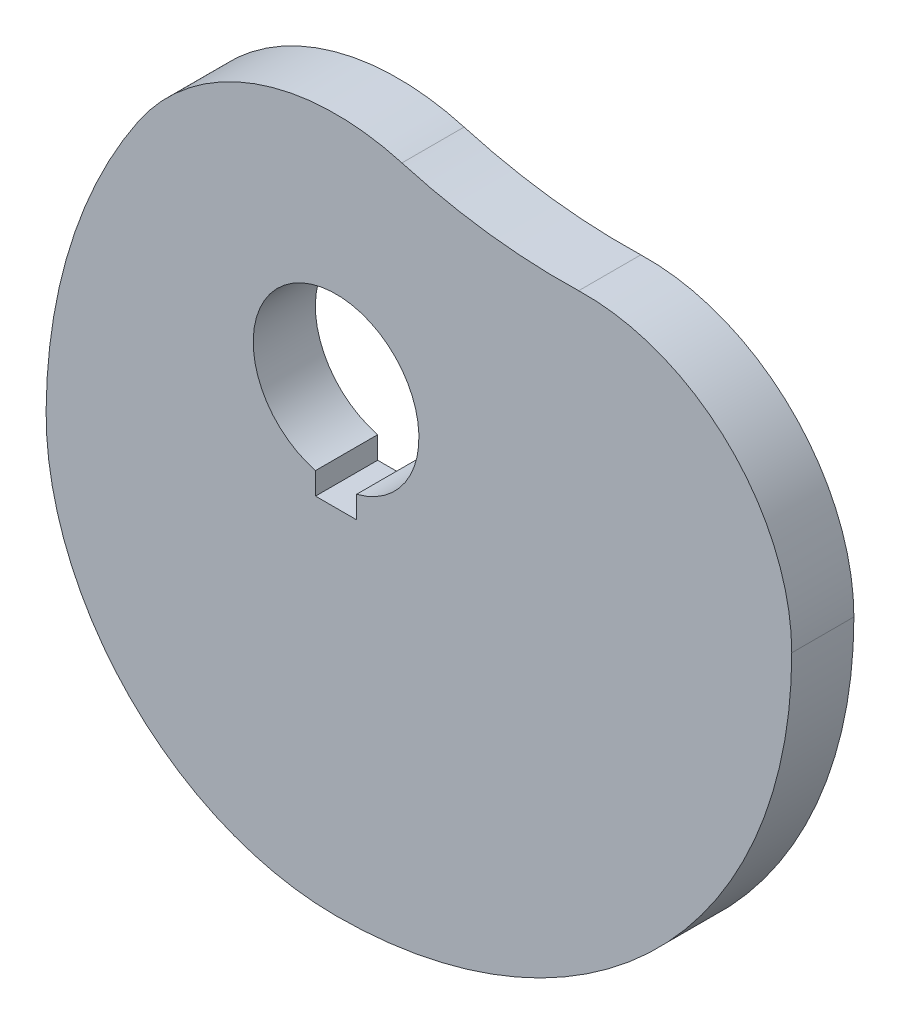
ISO-10303-21;
HEADER;
FILE_DESCRIPTION(('STEP AP214'),'2;1');
FILE_NAME('part.step','',(''),(''),'','','');
FILE_SCHEMA(('AUTOMOTIVE_DESIGN { 1 0 10303 214 1 1 1 1 }'));
ENDSEC;
DATA;
#1=APPLICATION_CONTEXT('core data for automotive mechanical design processes');
#2=APPLICATION_PROTOCOL_DEFINITION('international standard','automotive_design',2000,#1);
#3=PRODUCT_CONTEXT('',#1,'mechanical');
#4=PRODUCT('Part','Part','',(#3));
#5=PRODUCT_RELATED_PRODUCT_CATEGORY('part','',(#4));
#6=PRODUCT_DEFINITION_FORMATION('','',#4);
#7=PRODUCT_DEFINITION_CONTEXT('part definition',#1,'design');
#8=PRODUCT_DEFINITION('design','',#6,#7);
#9=PRODUCT_DEFINITION_SHAPE('','',#8);
#10=(LENGTH_UNIT() NAMED_UNIT(*) SI_UNIT(.MILLI.,.METRE.));
#11=(NAMED_UNIT(*) PLANE_ANGLE_UNIT() SI_UNIT($,.RADIAN.));
#12=(NAMED_UNIT(*) SI_UNIT($,.STERADIAN.) SOLID_ANGLE_UNIT());
#13=UNCERTAINTY_MEASURE_WITH_UNIT(LENGTH_MEASURE(1.E-05),#10,'distance_accuracy_value','');
#14=(GEOMETRIC_REPRESENTATION_CONTEXT(3) GLOBAL_UNCERTAINTY_ASSIGNED_CONTEXT((#13)) GLOBAL_UNIT_ASSIGNED_CONTEXT((#10,
#11,#12)) REPRESENTATION_CONTEXT('',''));
#15=CARTESIAN_POINT('',(0.,0.,0.));
#16=DIRECTION('',(0.,0.,1.));
#17=DIRECTION('',(1.,0.,0.));
#18=AXIS2_PLACEMENT_3D('',#15,#16,#17);
#19=CARTESIAN_POINT('',(1.57435915891416,-6.15173904182738,2.38125));
#20=DIRECTION('',(-1.,0.,0.));
#21=DIRECTION('',(0.,0.,1.));
#22=AXIS2_PLACEMENT_3D('',#19,#20,#21);
#23=PLANE('',#22);
#24=DIRECTION('',(0.,1.,0.));
#25=VECTOR('',#24,1.);
#26=CARTESIAN_POINT('',(1.57435915891416,-6.15173904182738,2.38125));
#27=LINE('',#26,#25);
#28=CARTESIAN_POINT('',(1.57435915891416,-7.84976349286583,2.38125));
#29=VERTEX_POINT('',#28);
#30=CARTESIAN_POINT('',(1.57435915891416,-6.15173904182737,2.38125));
#31=VERTEX_POINT('',#30);
#32=EDGE_CURVE('E102',#29,#31,#27,.T.);
#33=ORIENTED_EDGE('',*,*,#32,.T.);
#34=DIRECTION('',(0.,0.,-1.));
#35=VECTOR('',#34,1.);
#36=CARTESIAN_POINT('',(1.57435915891416,-6.15173904182737,2.38125));
#37=LINE('',#36,#35);
#38=CARTESIAN_POINT('',(1.57435915891416,-6.15173904182737,-2.38125));
#39=VERTEX_POINT('',#38);
#40=EDGE_CURVE('E168',#39,#31,#37,.F.);
#41=ORIENTED_EDGE('',*,*,#40,.F.);
#42=DIRECTION('',(0.,1.,0.));
#43=VECTOR('',#42,1.);
#44=CARTESIAN_POINT('',(1.57435915891416,-7.37633325819303,-2.38125));
#45=LINE('',#44,#43);
#46=CARTESIAN_POINT('',(1.57435915891416,-7.84976349286583,-2.38125));
#47=VERTEX_POINT('',#46);
#48=EDGE_CURVE('E115',#39,#47,#45,.F.);
#49=ORIENTED_EDGE('',*,*,#48,.T.);
#50=DIRECTION('',(0.,0.,1.));
#51=VECTOR('',#50,1.);
#52=CARTESIAN_POINT('',(1.57435915891416,-7.84976349286583,2.38125));
#53=LINE('',#52,#51);
#54=EDGE_CURVE('E114',#29,#47,#53,.F.);
#55=ORIENTED_EDGE('',*,*,#54,.F.);
#56=EDGE_LOOP('',(#33,#41,#49,#55));
#57=FACE_BOUND('',#56,.T.);
#58=ADVANCED_FACE('F17',(#57),#23,.T.);
#59=CARTESIAN_POINT('',(-1.57435915891425,-7.84976349286583,2.38125));
#60=DIRECTION('',(1.,0.,0.));
#61=DIRECTION('',(0.,1.,0.));
#62=AXIS2_PLACEMENT_3D('',#59,#60,#61);
#63=PLANE('',#62);
#64=DIRECTION('',(0.,1.,0.));
#65=VECTOR('',#64,1.);
#66=CARTESIAN_POINT('',(-1.57435915891425,-7.84976349286583,2.38125));
#67=LINE('',#66,#65);
#68=CARTESIAN_POINT('',(-1.57435915891412,-6.15173904182738,2.38125));
#69=VERTEX_POINT('',#68);
#70=CARTESIAN_POINT('',(-1.57435915891425,-7.84976349286583,2.38125));
#71=VERTEX_POINT('',#70);
#72=EDGE_CURVE('E96',#69,#71,#67,.F.);
#73=ORIENTED_EDGE('',*,*,#72,.T.);
#74=DIRECTION('',(0.,0.,1.));
#75=VECTOR('',#74,1.);
#76=CARTESIAN_POINT('',(-1.57435915891425,-7.84976349286583,2.38125));
#77=LINE('',#76,#75);
#78=CARTESIAN_POINT('',(-1.57435915891425,-7.84976349286583,-2.38125));
#79=VERTEX_POINT('',#78);
#80=EDGE_CURVE('E118',#79,#71,#77,.T.);
#81=ORIENTED_EDGE('',*,*,#80,.F.);
#82=DIRECTION('',(0.,1.,0.));
#83=VECTOR('',#82,1.);
#84=CARTESIAN_POINT('',(-1.57435915891425,-7.37633325819303,-2.38125));
#85=LINE('',#84,#83);
#86=CARTESIAN_POINT('',(-1.57435915891416,-6.15173904182737,-2.38125));
#87=VERTEX_POINT('',#86);
#88=EDGE_CURVE('E86',#79,#87,#85,.T.);
#89=ORIENTED_EDGE('',*,*,#88,.T.);
#90=DIRECTION('',(0.,0.,-1.));
#91=VECTOR('',#90,1.);
#92=CARTESIAN_POINT('',(-1.57435915891407,-6.15173904182739,2.38125));
#93=LINE('',#92,#91);
#94=EDGE_CURVE('E163',#69,#87,#93,.T.);
#95=ORIENTED_EDGE('',*,*,#94,.F.);
#96=EDGE_LOOP('',(#73,#81,#89,#95));
#97=FACE_BOUND('',#96,.T.);
#98=ADVANCED_FACE('F243',(#97),#63,.T.);
#99=CARTESIAN_POINT('',(5.61576722870933,-7.37633325819303,-2.38125));
#100=DIRECTION('',(0.,0.,1.));
#101=DIRECTION('',(1.,0.,0.));
#102=AXIS2_PLACEMENT_3D('',#99,#100,#101);
#103=PLANE('',#102);
#104=CARTESIAN_POINT('',(0.,0.,-2.38125));
#105=DIRECTION('',(0.,0.,-1.));
#106=DIRECTION('',(0.,1.,0.));
#107=AXIS2_PLACEMENT_3D('',#104,#105,#106);
#108=CIRCLE('',#107,18.288);
#109=CARTESIAN_POINT('',(5.04845052631571,17.5773744138123,-2.38125));
#110=VERTEX_POINT('',#109);
#111=CARTESIAN_POINT('',(-15.1552275228258,10.2357228729281,-2.38125));
#112=VERTEX_POINT('',#111);
#113=EDGE_CURVE('E161',#110,#112,#108,.F.);
#114=ORIENTED_EDGE('',*,*,#113,.F.);
#115=CARTESIAN_POINT('',(17.3189899999999,60.3001594473836,-2.38125));
#116=DIRECTION('',(0.,0.,-1.));
#117=DIRECTION('',(-1.,0.,0.));
#118=AXIS2_PLACEMENT_3D('',#115,#116,#117);
#119=CIRCLE('',#118,44.4499999999999);
#120=CARTESIAN_POINT('',(18.5944710526316,15.8684630124694,-2.38125));
#121=VERTEX_POINT('',#120);
#122=EDGE_CURVE('E144',#121,#110,#119,.T.);
#123=ORIENTED_EDGE('',*,*,#122,.F.);
#124=CARTESIAN_POINT('',(19.05,0.,-2.38125));
#125=DIRECTION('',(0.,0.,-1.));
#126=DIRECTION('',(0.,1.,0.));
#127=AXIS2_PLACEMENT_3D('',#124,#125,#126);
#128=CIRCLE('',#127,15.875);
#129=CARTESIAN_POINT('',(34.925,0.,-2.38125));
#130=VERTEX_POINT('',#129);
#131=EDGE_CURVE('E148',#130,#121,#128,.F.);
#132=ORIENTED_EDGE('',*,*,#131,.F.);
#133=CARTESIAN_POINT('',(0.,0.,-2.38125));
#134=DIRECTION('',(0.,0.,-1.));
#135=DIRECTION('',(0.,1.,0.));
#136=AXIS2_PLACEMENT_3D('',#133,#134,#135);
#137=CIRCLE('',#136,34.925);
#138=CARTESIAN_POINT('',(0.,-34.925,-2.38125));
#139=VERTEX_POINT('',#138);
#140=EDGE_CURVE('E151',#139,#130,#137,.F.);
#141=ORIENTED_EDGE('',*,*,#140,.F.);
#142=CARTESIAN_POINT('',(0.,-12.7,-2.38125));
#143=DIRECTION('',(0.,0.,-1.));
#144=DIRECTION('',(0.,1.,0.));
#145=AXIS2_PLACEMENT_3D('',#142,#143,#144);
#146=CIRCLE('',#145,22.225);
#147=CARTESIAN_POINT('',(-22.2241588789586,-12.5066425000001,-2.38125));
#148=VERTEX_POINT('',#147);
#149=EDGE_CURVE('E155',#148,#139,#146,.F.);
#150=ORIENTED_EDGE('',*,*,#149,.F.);
#151=CARTESIAN_POINT('',(19.0492790391074,-12.8657349999999,-2.38125));
#152=DIRECTION('',(0.,0.,-1.));
#153=DIRECTION('',(0.,1.,0.));
#154=AXIS2_PLACEMENT_3D('',#151,#152,#153);
#155=CIRCLE('',#154,41.275);
#156=EDGE_CURVE('E159',#112,#148,#155,.F.);
#157=ORIENTED_EDGE('',*,*,#156,.F.);
#158=EDGE_LOOP('',(#114,#123,#132,#141,#150,#157));
#159=FACE_BOUND('',#158,.T.);
#160=DIRECTION('',(1.,0.,0.));
#161=VECTOR('',#160,1.);
#162=CARTESIAN_POINT('',(1.57435915891416,-7.84976349286583,-2.38125));
#163=LINE('',#162,#161);
#164=EDGE_CURVE('E176',#47,#79,#163,.F.);
#165=ORIENTED_EDGE('',*,*,#164,.F.);
#166=ORIENTED_EDGE('',*,*,#48,.F.);
#167=CARTESIAN_POINT('',(0.,0.,-2.38125));
#168=DIRECTION('',(0.,0.,-1.));
#169=DIRECTION('',(0.,1.,0.));
#170=AXIS2_PLACEMENT_3D('',#167,#168,#169);
#171=CIRCLE('',#170,6.35);
#172=EDGE_CURVE('E20',#87,#39,#171,.T.);
#173=ORIENTED_EDGE('',*,*,#172,.F.);
#174=ORIENTED_EDGE('',*,*,#88,.F.);
#175=EDGE_LOOP('',(#165,#166,#173,#174));
#176=FACE_BOUND('',#175,.T.);
#177=ADVANCED_FACE('F192',(#159,#176),#103,.F.);
#178=CARTESIAN_POINT('',(1.57435915891416,-7.84976349286583,2.38125));
#179=DIRECTION('',(0.,1.,0.));
#180=DIRECTION('',(0.,0.,1.));
#181=AXIS2_PLACEMENT_3D('',#178,#179,#180);
#182=PLANE('',#181);
#183=DIRECTION('',(1.,0.,0.));
#184=VECTOR('',#183,1.);
#185=CARTESIAN_POINT('',(5.61576722870933,-7.84976349286583,2.38125));
#186=LINE('',#185,#184);
#187=EDGE_CURVE('E106',#29,#71,#186,.F.);
#188=ORIENTED_EDGE('',*,*,#187,.F.);
#189=ORIENTED_EDGE('',*,*,#54,.T.);
#190=ORIENTED_EDGE('',*,*,#164,.T.);
#191=ORIENTED_EDGE('',*,*,#80,.T.);
#192=EDGE_LOOP('',(#188,#189,#190,#191));
#193=FACE_BOUND('',#192,.T.);
#194=ADVANCED_FACE('F120',(#193),#182,.T.);
#195=CARTESIAN_POINT('',(0.,0.,2.38125));
#196=DIRECTION('',(0.,0.,-1.));
#197=DIRECTION('',(0.,1.,0.));
#198=AXIS2_PLACEMENT_3D('',#195,#196,#197);
#199=CYLINDRICAL_SURFACE('',#198,6.35);
#200=CARTESIAN_POINT('',(0.,0.,2.38125));
#201=DIRECTION('',(0.,0.,-1.));
#202=DIRECTION('',(0.,1.,0.));
#203=AXIS2_PLACEMENT_3D('',#200,#201,#202);
#204=CIRCLE('',#203,6.35);
#205=EDGE_CURVE('E108',#69,#31,#204,.T.);
#206=ORIENTED_EDGE('',*,*,#205,.F.);
#207=ORIENTED_EDGE('',*,*,#94,.T.);
#208=ORIENTED_EDGE('',*,*,#172,.T.);
#209=ORIENTED_EDGE('',*,*,#40,.T.);
#210=EDGE_LOOP('',(#206,#207,#208,#209));
#211=FACE_BOUND('',#210,.T.);
#212=ADVANCED_FACE('F193',(#211),#199,.F.);
#213=CARTESIAN_POINT('',(0.,0.,2.38125));
#214=DIRECTION('',(0.,0.,-1.));
#215=DIRECTION('',(0.,1.,0.));
#216=AXIS2_PLACEMENT_3D('',#213,#214,#215);
#217=CYLINDRICAL_SURFACE('',#216,18.288);
#218=CARTESIAN_POINT('',(0.,0.,2.38125));
#219=DIRECTION('',(0.,0.,-1.));
#220=DIRECTION('',(0.,1.,0.));
#221=AXIS2_PLACEMENT_3D('',#218,#219,#220);
#222=CIRCLE('',#221,18.288);
#223=CARTESIAN_POINT('',(5.04845052631571,17.5773744138123,2.38125));
#224=VERTEX_POINT('',#223);
#225=CARTESIAN_POINT('',(-15.1552275228258,10.2357228729281,2.38125));
#226=VERTEX_POINT('',#225);
#227=EDGE_CURVE('E122',#224,#226,#222,.F.);
#228=ORIENTED_EDGE('',*,*,#227,.F.);
#229=DIRECTION('',(0.,0.,-1.));
#230=VECTOR('',#229,1.);
#231=CARTESIAN_POINT('',(5.04845052631572,17.5773744138123,2.38125));
#232=LINE('',#231,#230);
#233=EDGE_CURVE('E124',#110,#224,#232,.F.);
#234=ORIENTED_EDGE('',*,*,#233,.F.);
#235=ORIENTED_EDGE('',*,*,#113,.T.);
#236=DIRECTION('',(0.,0.,-1.));
#237=VECTOR('',#236,1.);
#238=CARTESIAN_POINT('',(-15.1552275228258,10.2357228729282,2.38125));
#239=LINE('',#238,#237);
#240=EDGE_CURVE('E158',#226,#112,#239,.T.);
#241=ORIENTED_EDGE('',*,*,#240,.F.);
#242=EDGE_LOOP('',(#228,#234,#235,#241));
#243=FACE_BOUND('',#242,.T.);
#244=ADVANCED_FACE('F195',(#243),#217,.T.);
#245=CARTESIAN_POINT('',(19.0492790391074,-12.8657349999999,2.38125));
#246=DIRECTION('',(0.,0.,-1.));
#247=DIRECTION('',(0.,1.,0.));
#248=AXIS2_PLACEMENT_3D('',#245,#246,#247);
#249=CYLINDRICAL_SURFACE('',#248,41.275);
#250=CARTESIAN_POINT('',(19.0492790391074,-12.8657349999999,2.38125));
#251=DIRECTION('',(0.,0.,-1.));
#252=DIRECTION('',(0.,1.,0.));
#253=AXIS2_PLACEMENT_3D('',#250,#251,#252);
#254=CIRCLE('',#253,41.275);
#255=CARTESIAN_POINT('',(-22.2241588789586,-12.5066425000001,2.38125));
#256=VERTEX_POINT('',#255);
#257=EDGE_CURVE('E139',#226,#256,#254,.F.);
#258=ORIENTED_EDGE('',*,*,#257,.F.);
#259=ORIENTED_EDGE('',*,*,#240,.T.);
#260=ORIENTED_EDGE('',*,*,#156,.T.);
#261=DIRECTION('',(0.,0.,-1.));
#262=VECTOR('',#261,1.);
#263=CARTESIAN_POINT('',(-22.2241588789586,-12.5066425,2.38125));
#264=LINE('',#263,#262);
#265=EDGE_CURVE('E154',#256,#148,#264,.T.);
#266=ORIENTED_EDGE('',*,*,#265,.F.);
#267=EDGE_LOOP('',(#258,#259,#260,#266));
#268=FACE_BOUND('',#267,.T.);
#269=ADVANCED_FACE('F202',(#268),#249,.T.);
#270=CARTESIAN_POINT('',(0.,-12.7,2.38125));
#271=DIRECTION('',(0.,0.,-1.));
#272=DIRECTION('',(0.,1.,0.));
#273=AXIS2_PLACEMENT_3D('',#270,#271,#272);
#274=CYLINDRICAL_SURFACE('',#273,22.225);
#275=CARTESIAN_POINT('',(0.,-12.7,2.38125));
#276=DIRECTION('',(0.,0.,-1.));
#277=DIRECTION('',(0.,1.,0.));
#278=AXIS2_PLACEMENT_3D('',#275,#276,#277);
#279=CIRCLE('',#278,22.225);
#280=CARTESIAN_POINT('',(0.,-34.925,2.38125));
#281=VERTEX_POINT('',#280);
#282=EDGE_CURVE('E136',#256,#281,#279,.F.);
#283=ORIENTED_EDGE('',*,*,#282,.F.);
#284=ORIENTED_EDGE('',*,*,#265,.T.);
#285=ORIENTED_EDGE('',*,*,#149,.T.);
#286=DIRECTION('',(0.,0.,-1.));
#287=VECTOR('',#286,1.);
#288=CARTESIAN_POINT('',(0.,-34.925,2.38125));
#289=LINE('',#288,#287);
#290=EDGE_CURVE('E150',#281,#139,#289,.T.);
#291=ORIENTED_EDGE('',*,*,#290,.F.);
#292=EDGE_LOOP('',(#283,#284,#285,#291));
#293=FACE_BOUND('',#292,.T.);
#294=ADVANCED_FACE('F221',(#293),#274,.T.);
#295=CARTESIAN_POINT('',(0.,0.,2.38125));
#296=DIRECTION('',(0.,0.,-1.));
#297=DIRECTION('',(0.,1.,0.));
#298=AXIS2_PLACEMENT_3D('',#295,#296,#297);
#299=CYLINDRICAL_SURFACE('',#298,34.925);
#300=CARTESIAN_POINT('',(0.,0.,2.38125));
#301=DIRECTION('',(0.,0.,-1.));
#302=DIRECTION('',(0.,1.,0.));
#303=AXIS2_PLACEMENT_3D('',#300,#301,#302);
#304=CIRCLE('',#303,34.925);
#305=CARTESIAN_POINT('',(34.925,0.,2.38125));
#306=VERTEX_POINT('',#305);
#307=EDGE_CURVE('E133',#281,#306,#304,.F.);
#308=ORIENTED_EDGE('',*,*,#307,.F.);
#309=ORIENTED_EDGE('',*,*,#290,.T.);
#310=ORIENTED_EDGE('',*,*,#140,.T.);
#311=DIRECTION('',(0.,0.,-1.));
#312=VECTOR('',#311,1.);
#313=CARTESIAN_POINT('',(34.925,0.,2.38125));
#314=LINE('',#313,#312);
#315=EDGE_CURVE('E147',#306,#130,#314,.T.);
#316=ORIENTED_EDGE('',*,*,#315,.F.);
#317=EDGE_LOOP('',(#308,#309,#310,#316));
#318=FACE_BOUND('',#317,.T.);
#319=ADVANCED_FACE('F218',(#318),#299,.T.);
#320=CARTESIAN_POINT('',(19.05,0.,2.38125));
#321=DIRECTION('',(0.,0.,-1.));
#322=DIRECTION('',(0.,1.,0.));
#323=AXIS2_PLACEMENT_3D('',#320,#321,#322);
#324=CYLINDRICAL_SURFACE('',#323,15.875);
#325=CARTESIAN_POINT('',(19.05,0.,2.38125));
#326=DIRECTION('',(0.,0.,-1.));
#327=DIRECTION('',(0.,1.,0.));
#328=AXIS2_PLACEMENT_3D('',#325,#326,#327);
#329=CIRCLE('',#328,15.875);
#330=CARTESIAN_POINT('',(18.5944710526316,15.8684630124694,2.38125));
#331=VERTEX_POINT('',#330);
#332=EDGE_CURVE('E26',#306,#331,#329,.F.);
#333=ORIENTED_EDGE('',*,*,#332,.F.);
#334=ORIENTED_EDGE('',*,*,#315,.T.);
#335=ORIENTED_EDGE('',*,*,#131,.T.);
#336=DIRECTION('',(0.,0.,-1.));
#337=VECTOR('',#336,1.);
#338=CARTESIAN_POINT('',(18.5944710526316,15.8684630124694,2.38125));
#339=LINE('',#338,#337);
#340=EDGE_CURVE('E35',#331,#121,#339,.T.);
#341=ORIENTED_EDGE('',*,*,#340,.F.);
#342=EDGE_LOOP('',(#333,#334,#335,#341));
#343=FACE_BOUND('',#342,.T.);
#344=ADVANCED_FACE('F212',(#343),#324,.T.);
#345=CARTESIAN_POINT('',(17.3189899999999,60.3001594473836,2.38125));
#346=DIRECTION('',(0.,0.,-1.));
#347=DIRECTION('',(-1.,0.,0.));
#348=AXIS2_PLACEMENT_3D('',#345,#346,#347);
#349=CYLINDRICAL_SURFACE('',#348,44.4499999999999);
#350=CARTESIAN_POINT('',(17.3189899999999,60.3001594473836,2.38125));
#351=DIRECTION('',(0.,0.,-1.));
#352=DIRECTION('',(-1.,0.,0.));
#353=AXIS2_PLACEMENT_3D('',#350,#351,#352);
#354=CIRCLE('',#353,44.4499999999999);
#355=EDGE_CURVE('E11',#331,#224,#354,.T.);
#356=ORIENTED_EDGE('',*,*,#355,.F.);
#357=ORIENTED_EDGE('',*,*,#340,.T.);
#358=ORIENTED_EDGE('',*,*,#122,.T.);
#359=ORIENTED_EDGE('',*,*,#233,.T.);
#360=EDGE_LOOP('',(#356,#357,#358,#359));
#361=FACE_BOUND('',#360,.T.);
#362=ADVANCED_FACE('F206',(#361),#349,.F.);
#363=CARTESIAN_POINT('',(5.61576722870933,-7.37633325819303,2.38125));
#364=DIRECTION('',(0.,0.,1.));
#365=DIRECTION('',(1.,0.,0.));
#366=AXIS2_PLACEMENT_3D('',#363,#364,#365);
#367=PLANE('',#366);
#368=ORIENTED_EDGE('',*,*,#332,.T.);
#369=ORIENTED_EDGE('',*,*,#355,.T.);
#370=ORIENTED_EDGE('',*,*,#227,.T.);
#371=ORIENTED_EDGE('',*,*,#257,.T.);
#372=ORIENTED_EDGE('',*,*,#282,.T.);
#373=ORIENTED_EDGE('',*,*,#307,.T.);
#374=EDGE_LOOP('',(#368,#369,#370,#371,#372,#373));
#375=FACE_BOUND('',#374,.T.);
#376=ORIENTED_EDGE('',*,*,#205,.T.);
#377=ORIENTED_EDGE('',*,*,#32,.F.);
#378=ORIENTED_EDGE('',*,*,#187,.T.);
#379=ORIENTED_EDGE('',*,*,#72,.F.);
#380=EDGE_LOOP('',(#376,#377,#378,#379));
#381=FACE_BOUND('',#380,.T.);
#382=ADVANCED_FACE('F104',(#375,#381),#367,.T.);
#383=CLOSED_SHELL('',(#58,#98,#177,#194,#212,#244,#269,#294,#319,#344,#362,#382));
#384=MANIFOLD_SOLID_BREP('B1',#383);
#385=ADVANCED_BREP_SHAPE_REPRESENTATION('',(#18,#384),#14);
#386=SHAPE_DEFINITION_REPRESENTATION(#9,#385);
ENDSEC;
END-ISO-10303-21;
